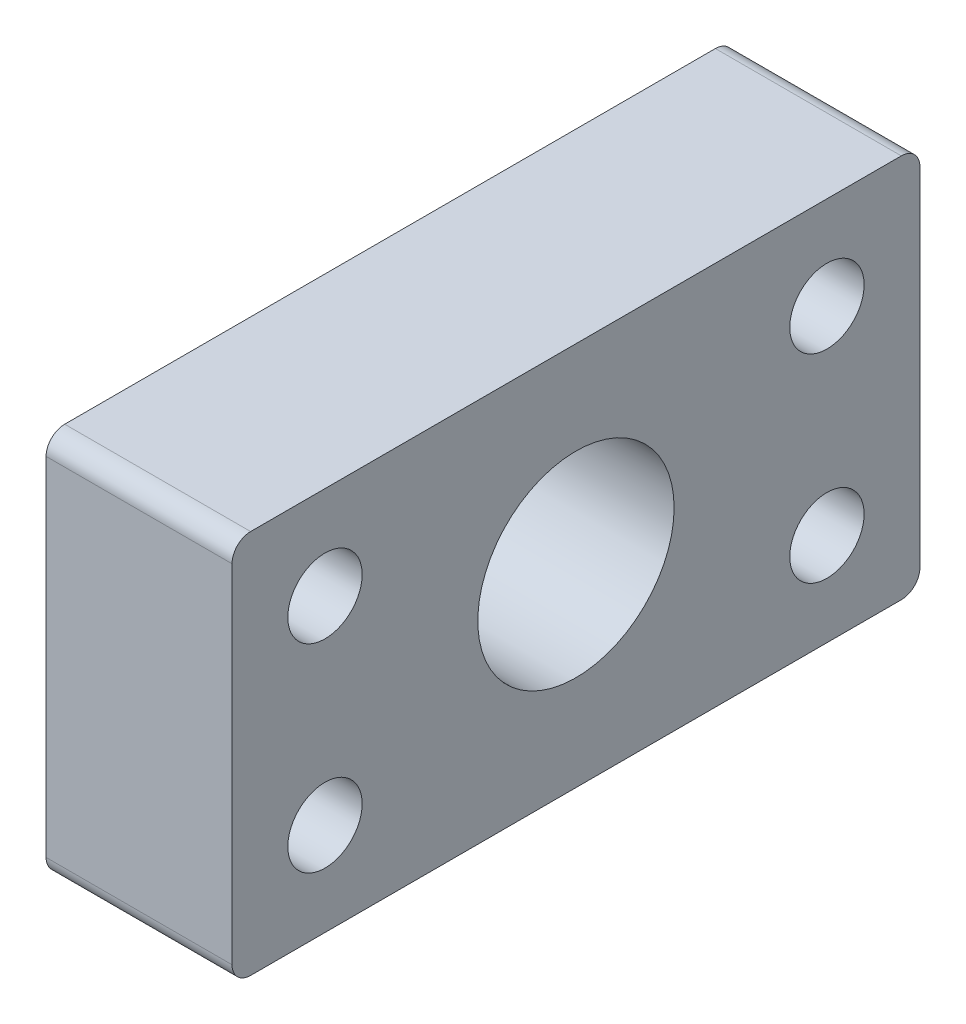
ISO-10303-21;
HEADER;
FILE_DESCRIPTION(('STEP AP214'),'2;1');
FILE_NAME('part.step','',(''),(''),'','','');
FILE_SCHEMA(('AUTOMOTIVE_DESIGN { 1 0 10303 214 1 1 1 1 }'));
ENDSEC;
DATA;
#1=APPLICATION_CONTEXT('core data for automotive mechanical design processes');
#2=APPLICATION_PROTOCOL_DEFINITION('international standard','automotive_design',2000,#1);
#3=PRODUCT_CONTEXT('',#1,'mechanical');
#4=PRODUCT('Part','Part','',(#3));
#5=PRODUCT_RELATED_PRODUCT_CATEGORY('part','',(#4));
#6=PRODUCT_DEFINITION_FORMATION('','',#4);
#7=PRODUCT_DEFINITION_CONTEXT('part definition',#1,'design');
#8=PRODUCT_DEFINITION('design','',#6,#7);
#9=PRODUCT_DEFINITION_SHAPE('','',#8);
#10=(LENGTH_UNIT() NAMED_UNIT(*) SI_UNIT(.MILLI.,.METRE.));
#11=(NAMED_UNIT(*) PLANE_ANGLE_UNIT() SI_UNIT($,.RADIAN.));
#12=(NAMED_UNIT(*) SI_UNIT($,.STERADIAN.) SOLID_ANGLE_UNIT());
#13=UNCERTAINTY_MEASURE_WITH_UNIT(LENGTH_MEASURE(1.E-05),#10,'distance_accuracy_value','');
#14=(GEOMETRIC_REPRESENTATION_CONTEXT(3) GLOBAL_UNCERTAINTY_ASSIGNED_CONTEXT((#13)) GLOBAL_UNIT_ASSIGNED_CONTEXT((#10,
#11,#12)) REPRESENTATION_CONTEXT('',''));
#15=CARTESIAN_POINT('',(0.,0.,0.));
#16=DIRECTION('',(0.,0.,1.));
#17=DIRECTION('',(1.,0.,0.));
#18=AXIS2_PLACEMENT_3D('',#15,#16,#17);
#19=CARTESIAN_POINT('',(10.,0.,-32.));
#20=DIRECTION('',(0.,0.,1.));
#21=DIRECTION('',(1.,0.,0.));
#22=AXIS2_PLACEMENT_3D('',#19,#20,#21);
#23=PLANE('',#22);
#24=DIRECTION('',(0.,1.,0.));
#25=VECTOR('',#24,1.);
#26=CARTESIAN_POINT('',(10.,0.,-32.));
#27=LINE('',#26,#25);
#28=CARTESIAN_POINT('',(10.,-4.,-32.));
#29=VERTEX_POINT('',#28);
#30=CARTESIAN_POINT('',(10.,14.68,-32.));
#31=VERTEX_POINT('',#30);
#32=EDGE_CURVE('E121',#29,#31,#27,.T.);
#33=ORIENTED_EDGE('',*,*,#32,.F.);
#34=DIRECTION('',(-1.,0.,0.));
#35=VECTOR('',#34,1.);
#36=CARTESIAN_POINT('',(0.,-4.,-32.));
#37=LINE('',#36,#35);
#38=CARTESIAN_POINT('',(0.,-4.,-32.));
#39=VERTEX_POINT('',#38);
#40=EDGE_CURVE('E106',#29,#39,#37,.T.);
#41=ORIENTED_EDGE('',*,*,#40,.T.);
#42=DIRECTION('',(0.,1.,0.));
#43=VECTOR('',#42,1.);
#44=CARTESIAN_POINT('',(0.,0.,-32.));
#45=LINE('',#44,#43);
#46=CARTESIAN_POINT('',(0.,14.68,-32.));
#47=VERTEX_POINT('',#46);
#48=EDGE_CURVE('E118',#39,#47,#45,.T.);
#49=ORIENTED_EDGE('',*,*,#48,.T.);
#50=DIRECTION('',(-1.,0.,0.));
#51=VECTOR('',#50,1.);
#52=CARTESIAN_POINT('',(10.,14.68,-32.));
#53=LINE('',#52,#51);
#54=EDGE_CURVE('E123',#47,#31,#53,.F.);
#55=ORIENTED_EDGE('',*,*,#54,.T.);
#56=EDGE_LOOP('',(#33,#41,#49,#55));
#57=FACE_BOUND('',#56,.T.);
#58=ADVANCED_FACE('F37',(#57),#23,.F.);
#59=CARTESIAN_POINT('',(10.,15.68,0.));
#60=DIRECTION('',(0.,-1.,0.));
#61=DIRECTION('',(0.,0.,-1.));
#62=AXIS2_PLACEMENT_3D('',#59,#60,#61);
#63=PLANE('',#62);
#64=DIRECTION('',(0.,0.,1.));
#65=VECTOR('',#64,1.);
#66=CARTESIAN_POINT('',(10.,15.68,0.));
#67=LINE('',#66,#65);
#68=CARTESIAN_POINT('',(10.,15.68,-31.));
#69=VERTEX_POINT('',#68);
#70=CARTESIAN_POINT('',(10.,15.68,4.));
#71=VERTEX_POINT('',#70);
#72=EDGE_CURVE('E177',#69,#71,#67,.T.);
#73=ORIENTED_EDGE('',*,*,#72,.F.);
#74=DIRECTION('',(-1.,0.,0.));
#75=VECTOR('',#74,1.);
#76=CARTESIAN_POINT('',(10.,15.68,-31.));
#77=LINE('',#76,#75);
#78=CARTESIAN_POINT('',(0.,15.68,-31.));
#79=VERTEX_POINT('',#78);
#80=EDGE_CURVE('E161',#69,#79,#77,.T.);
#81=ORIENTED_EDGE('',*,*,#80,.T.);
#82=DIRECTION('',(0.,0.,1.));
#83=VECTOR('',#82,1.);
#84=CARTESIAN_POINT('',(0.,15.68,0.));
#85=LINE('',#84,#83);
#86=CARTESIAN_POINT('',(0.,15.68,4.));
#87=VERTEX_POINT('',#86);
#88=EDGE_CURVE('E127',#79,#87,#85,.T.);
#89=ORIENTED_EDGE('',*,*,#88,.T.);
#90=DIRECTION('',(-1.,0.,0.));
#91=VECTOR('',#90,1.);
#92=CARTESIAN_POINT('',(10.,15.68,4.));
#93=LINE('',#92,#91);
#94=EDGE_CURVE('E159',#87,#71,#93,.F.);
#95=ORIENTED_EDGE('',*,*,#94,.T.);
#96=EDGE_LOOP('',(#73,#81,#89,#95));
#97=FACE_BOUND('',#96,.T.);
#98=ADVANCED_FACE('F211',(#97),#63,.F.);
#99=CARTESIAN_POINT('',(10.,0.,5.));
#100=DIRECTION('',(0.,0.,1.));
#101=DIRECTION('',(1.,0.,0.));
#102=AXIS2_PLACEMENT_3D('',#99,#100,#101);
#103=PLANE('',#102);
#104=DIRECTION('',(0.,1.,0.));
#105=VECTOR('',#104,1.);
#106=CARTESIAN_POINT('',(0.,0.,5.));
#107=LINE('',#106,#105);
#108=CARTESIAN_POINT('',(0.,-4.,5.));
#109=VERTEX_POINT('',#108);
#110=CARTESIAN_POINT('',(0.,14.68,5.));
#111=VERTEX_POINT('',#110);
#112=EDGE_CURVE('E131',#109,#111,#107,.T.);
#113=ORIENTED_EDGE('',*,*,#112,.F.);
#114=DIRECTION('',(-1.,0.,0.));
#115=VECTOR('',#114,1.);
#116=CARTESIAN_POINT('',(10.,-4.,5.));
#117=LINE('',#116,#115);
#118=CARTESIAN_POINT('',(10.,-4.,5.));
#119=VERTEX_POINT('',#118);
#120=EDGE_CURVE('E11',#109,#119,#117,.F.);
#121=ORIENTED_EDGE('',*,*,#120,.T.);
#122=DIRECTION('',(0.,1.,0.));
#123=VECTOR('',#122,1.);
#124=CARTESIAN_POINT('',(10.,0.,5.));
#125=LINE('',#124,#123);
#126=CARTESIAN_POINT('',(10.,14.68,5.));
#127=VERTEX_POINT('',#126);
#128=EDGE_CURVE('E166',#119,#127,#125,.T.);
#129=ORIENTED_EDGE('',*,*,#128,.T.);
#130=DIRECTION('',(-1.,0.,0.));
#131=VECTOR('',#130,1.);
#132=CARTESIAN_POINT('',(0.,14.68,5.));
#133=LINE('',#132,#131);
#134=EDGE_CURVE('E45',#127,#111,#133,.T.);
#135=ORIENTED_EDGE('',*,*,#134,.T.);
#136=EDGE_LOOP('',(#113,#121,#129,#135));
#137=FACE_BOUND('',#136,.T.);
#138=ADVANCED_FACE('F165',(#137),#103,.T.);
#139=CARTESIAN_POINT('',(10.,10.68,0.));
#140=DIRECTION('',(-1.,0.,0.));
#141=DIRECTION('',(0.,0.,1.));
#142=AXIS2_PLACEMENT_3D('',#139,#140,#141);
#143=CYLINDRICAL_SURFACE('',#142,2.);
#144=CARTESIAN_POINT('',(10.,10.68,0.));
#145=DIRECTION('',(1.,0.,0.));
#146=DIRECTION('',(0.,0.,-1.));
#147=AXIS2_PLACEMENT_3D('',#144,#145,#146);
#148=CIRCLE('',#147,2.);
#149=CARTESIAN_POINT('',(10.,10.68,-2.));
#150=VERTEX_POINT('',#149);
#151=EDGE_CURVE('E248',#150,#150,#148,.T.);
#152=ORIENTED_EDGE('',*,*,#151,.T.);
#153=EDGE_LOOP('',(#152));
#154=FACE_BOUND('',#153,.T.);
#155=CARTESIAN_POINT('',(0.,10.68,0.));
#156=DIRECTION('',(1.,0.,0.));
#157=DIRECTION('',(0.,0.,-1.));
#158=AXIS2_PLACEMENT_3D('',#155,#156,#157);
#159=CIRCLE('',#158,2.);
#160=CARTESIAN_POINT('',(0.,10.68,-2.));
#161=VERTEX_POINT('',#160);
#162=EDGE_CURVE('E128',#161,#161,#159,.T.);
#163=ORIENTED_EDGE('',*,*,#162,.F.);
#164=EDGE_LOOP('',(#163));
#165=FACE_BOUND('',#164,.T.);
#166=ADVANCED_FACE('F197',(#154,#165),#143,.F.);
#167=CARTESIAN_POINT('',(10.,10.68,-27.));
#168=DIRECTION('',(-1.,0.,0.));
#169=DIRECTION('',(0.,0.,1.));
#170=AXIS2_PLACEMENT_3D('',#167,#168,#169);
#171=CYLINDRICAL_SURFACE('',#170,2.);
#172=CARTESIAN_POINT('',(10.,10.68,-27.));
#173=DIRECTION('',(1.,0.,0.));
#174=DIRECTION('',(0.,0.,-1.));
#175=AXIS2_PLACEMENT_3D('',#172,#173,#174);
#176=CIRCLE('',#175,2.);
#177=CARTESIAN_POINT('',(10.,10.68,-29.));
#178=VERTEX_POINT('',#177);
#179=EDGE_CURVE('E245',#178,#178,#176,.T.);
#180=ORIENTED_EDGE('',*,*,#179,.T.);
#181=EDGE_LOOP('',(#180));
#182=FACE_BOUND('',#181,.T.);
#183=CARTESIAN_POINT('',(0.,10.68,-27.));
#184=DIRECTION('',(1.,0.,0.));
#185=DIRECTION('',(0.,0.,-1.));
#186=AXIS2_PLACEMENT_3D('',#183,#184,#185);
#187=CIRCLE('',#186,2.);
#188=CARTESIAN_POINT('',(0.,10.68,-29.));
#189=VERTEX_POINT('',#188);
#190=EDGE_CURVE('E134',#189,#189,#187,.T.);
#191=ORIENTED_EDGE('',*,*,#190,.F.);
#192=EDGE_LOOP('',(#191));
#193=FACE_BOUND('',#192,.T.);
#194=ADVANCED_FACE('F194',(#182,#193),#171,.F.);
#195=CARTESIAN_POINT('',(10.,0.,-27.));
#196=DIRECTION('',(-1.,0.,0.));
#197=DIRECTION('',(0.,0.,1.));
#198=AXIS2_PLACEMENT_3D('',#195,#196,#197);
#199=CYLINDRICAL_SURFACE('',#198,2.);
#200=CARTESIAN_POINT('',(10.,0.,-27.));
#201=DIRECTION('',(1.,0.,0.));
#202=DIRECTION('',(0.,0.,-1.));
#203=AXIS2_PLACEMENT_3D('',#200,#201,#202);
#204=CIRCLE('',#203,2.);
#205=CARTESIAN_POINT('',(10.,0.,-29.));
#206=VERTEX_POINT('',#205);
#207=EDGE_CURVE('E242',#206,#206,#204,.T.);
#208=ORIENTED_EDGE('',*,*,#207,.T.);
#209=EDGE_LOOP('',(#208));
#210=FACE_BOUND('',#209,.T.);
#211=CARTESIAN_POINT('',(0.,0.,-27.));
#212=DIRECTION('',(1.,0.,0.));
#213=DIRECTION('',(0.,0.,-1.));
#214=AXIS2_PLACEMENT_3D('',#211,#212,#213);
#215=CIRCLE('',#214,2.);
#216=CARTESIAN_POINT('',(0.,0.,-29.));
#217=VERTEX_POINT('',#216);
#218=EDGE_CURVE('E187',#217,#217,#215,.T.);
#219=ORIENTED_EDGE('',*,*,#218,.F.);
#220=EDGE_LOOP('',(#219));
#221=FACE_BOUND('',#220,.T.);
#222=ADVANCED_FACE('F196',(#210,#221),#199,.F.);
#223=CARTESIAN_POINT('',(10.,0.,0.));
#224=DIRECTION('',(-1.,0.,0.));
#225=DIRECTION('',(0.,0.,1.));
#226=AXIS2_PLACEMENT_3D('',#223,#224,#225);
#227=CYLINDRICAL_SURFACE('',#226,2.);
#228=CARTESIAN_POINT('',(10.,0.,0.));
#229=DIRECTION('',(1.,0.,0.));
#230=DIRECTION('',(0.,0.,-1.));
#231=AXIS2_PLACEMENT_3D('',#228,#229,#230);
#232=CIRCLE('',#231,2.);
#233=CARTESIAN_POINT('',(10.,0.,-2.));
#234=VERTEX_POINT('',#233);
#235=EDGE_CURVE('E238',#234,#234,#232,.T.);
#236=ORIENTED_EDGE('',*,*,#235,.T.);
#237=EDGE_LOOP('',(#236));
#238=FACE_BOUND('',#237,.T.);
#239=CARTESIAN_POINT('',(0.,0.,0.));
#240=DIRECTION('',(1.,0.,0.));
#241=DIRECTION('',(0.,0.,-1.));
#242=AXIS2_PLACEMENT_3D('',#239,#240,#241);
#243=CIRCLE('',#242,2.);
#244=CARTESIAN_POINT('',(0.,0.,-2.));
#245=VERTEX_POINT('',#244);
#246=EDGE_CURVE('E184',#245,#245,#243,.T.);
#247=ORIENTED_EDGE('',*,*,#246,.F.);
#248=EDGE_LOOP('',(#247));
#249=FACE_BOUND('',#248,.T.);
#250=ADVANCED_FACE('F204',(#238,#249),#227,.F.);
#251=CARTESIAN_POINT('',(10.,5.39966999333004,-13.5));
#252=DIRECTION('',(-1.,0.,0.));
#253=DIRECTION('',(0.,0.,1.));
#254=AXIS2_PLACEMENT_3D('',#251,#252,#253);
#255=CYLINDRICAL_SURFACE('',#254,5.28033000666996);
#256=CARTESIAN_POINT('',(10.,5.39966999333004,-13.5));
#257=DIRECTION('',(1.,0.,0.));
#258=DIRECTION('',(0.,0.,-1.));
#259=AXIS2_PLACEMENT_3D('',#256,#257,#258);
#260=CIRCLE('',#259,5.28033000666996);
#261=CARTESIAN_POINT('',(10.,5.39966999333004,-18.78033000667));
#262=VERTEX_POINT('',#261);
#263=EDGE_CURVE('E142',#262,#262,#260,.T.);
#264=ORIENTED_EDGE('',*,*,#263,.T.);
#265=EDGE_LOOP('',(#264));
#266=FACE_BOUND('',#265,.T.);
#267=CARTESIAN_POINT('',(0.,5.39966999333004,-13.5));
#268=DIRECTION('',(1.,0.,0.));
#269=DIRECTION('',(0.,0.,-1.));
#270=AXIS2_PLACEMENT_3D('',#267,#268,#269);
#271=CIRCLE('',#270,5.28033000666996);
#272=CARTESIAN_POINT('',(0.,5.39966999333004,-18.78033000667));
#273=VERTEX_POINT('',#272);
#274=EDGE_CURVE('E181',#273,#273,#271,.T.);
#275=ORIENTED_EDGE('',*,*,#274,.F.);
#276=EDGE_LOOP('',(#275));
#277=FACE_BOUND('',#276,.T.);
#278=ADVANCED_FACE('F224',(#266,#277),#255,.F.);
#279=CARTESIAN_POINT('',(10.,-5.,0.));
#280=DIRECTION('',(0.,-1.,0.));
#281=DIRECTION('',(0.,0.,-1.));
#282=AXIS2_PLACEMENT_3D('',#279,#280,#281);
#283=PLANE('',#282);
#284=DIRECTION('',(0.,0.,1.));
#285=VECTOR('',#284,1.);
#286=CARTESIAN_POINT('',(0.,-5.,0.));
#287=LINE('',#286,#285);
#288=CARTESIAN_POINT('',(0.,-5.,-31.));
#289=VERTEX_POINT('',#288);
#290=CARTESIAN_POINT('',(0.,-5.,4.));
#291=VERTEX_POINT('',#290);
#292=EDGE_CURVE('E140',#289,#291,#287,.T.);
#293=ORIENTED_EDGE('',*,*,#292,.F.);
#294=DIRECTION('',(-1.,0.,0.));
#295=VECTOR('',#294,1.);
#296=CARTESIAN_POINT('',(10.,-5.,-31.));
#297=LINE('',#296,#295);
#298=CARTESIAN_POINT('',(10.,-5.,-31.));
#299=VERTEX_POINT('',#298);
#300=EDGE_CURVE('E107',#289,#299,#297,.F.);
#301=ORIENTED_EDGE('',*,*,#300,.T.);
#302=DIRECTION('',(0.,0.,1.));
#303=VECTOR('',#302,1.);
#304=CARTESIAN_POINT('',(10.,-5.,0.));
#305=LINE('',#304,#303);
#306=CARTESIAN_POINT('',(10.,-5.,4.));
#307=VERTEX_POINT('',#306);
#308=EDGE_CURVE('E143',#299,#307,#305,.T.);
#309=ORIENTED_EDGE('',*,*,#308,.T.);
#310=DIRECTION('',(-1.,0.,0.));
#311=VECTOR('',#310,1.);
#312=CARTESIAN_POINT('',(10.,-5.,4.));
#313=LINE('',#312,#311);
#314=EDGE_CURVE('E112',#307,#291,#313,.T.);
#315=ORIENTED_EDGE('',*,*,#314,.T.);
#316=EDGE_LOOP('',(#293,#301,#309,#315));
#317=FACE_BOUND('',#316,.T.);
#318=ADVANCED_FACE('F174',(#317),#283,.T.);
#319=CARTESIAN_POINT('',(10.,0.,0.));
#320=DIRECTION('',(1.,0.,0.));
#321=DIRECTION('',(0.,0.,-1.));
#322=AXIS2_PLACEMENT_3D('',#319,#320,#321);
#323=PLANE('',#322);
#324=ORIENTED_EDGE('',*,*,#263,.F.);
#325=EDGE_LOOP('',(#324));
#326=FACE_BOUND('',#325,.T.);
#327=ORIENTED_EDGE('',*,*,#235,.F.);
#328=EDGE_LOOP('',(#327));
#329=FACE_BOUND('',#328,.T.);
#330=ORIENTED_EDGE('',*,*,#207,.F.);
#331=EDGE_LOOP('',(#330));
#332=FACE_BOUND('',#331,.T.);
#333=ORIENTED_EDGE('',*,*,#179,.F.);
#334=EDGE_LOOP('',(#333));
#335=FACE_BOUND('',#334,.T.);
#336=ORIENTED_EDGE('',*,*,#151,.F.);
#337=EDGE_LOOP('',(#336));
#338=FACE_BOUND('',#337,.T.);
#339=ORIENTED_EDGE('',*,*,#308,.F.);
#340=CARTESIAN_POINT('',(10.,-4.,-31.));
#341=DIRECTION('',(1.,0.,0.));
#342=DIRECTION('',(0.,0.,-1.));
#343=AXIS2_PLACEMENT_3D('',#340,#341,#342);
#344=CIRCLE('',#343,1.);
#345=EDGE_CURVE('E157',#299,#29,#344,.T.);
#346=ORIENTED_EDGE('',*,*,#345,.T.);
#347=ORIENTED_EDGE('',*,*,#32,.T.);
#348=CARTESIAN_POINT('',(10.,14.68,-31.));
#349=DIRECTION('',(1.,0.,0.));
#350=DIRECTION('',(0.,0.,-1.));
#351=AXIS2_PLACEMENT_3D('',#348,#349,#350);
#352=CIRCLE('',#351,1.);
#353=EDGE_CURVE('E155',#31,#69,#352,.T.);
#354=ORIENTED_EDGE('',*,*,#353,.T.);
#355=ORIENTED_EDGE('',*,*,#72,.T.);
#356=CARTESIAN_POINT('',(10.,14.68,4.));
#357=DIRECTION('',(1.,0.,0.));
#358=DIRECTION('',(0.,0.,-1.));
#359=AXIS2_PLACEMENT_3D('',#356,#357,#358);
#360=CIRCLE('',#359,1.);
#361=EDGE_CURVE('E52',#71,#127,#360,.T.);
#362=ORIENTED_EDGE('',*,*,#361,.T.);
#363=ORIENTED_EDGE('',*,*,#128,.F.);
#364=CARTESIAN_POINT('',(10.,-4.,4.));
#365=DIRECTION('',(1.,0.,0.));
#366=DIRECTION('',(0.,0.,-1.));
#367=AXIS2_PLACEMENT_3D('',#364,#365,#366);
#368=CIRCLE('',#367,1.);
#369=EDGE_CURVE('E153',#119,#307,#368,.T.);
#370=ORIENTED_EDGE('',*,*,#369,.T.);
#371=EDGE_LOOP('',(#339,#346,#347,#354,#355,#362,#363,#370));
#372=FACE_BOUND('',#371,.T.);
#373=ADVANCED_FACE('F223',(#326,#329,#332,#335,#338,#372),#323,.T.);
#374=CARTESIAN_POINT('',(0.,0.,0.));
#375=DIRECTION('',(1.,0.,0.));
#376=DIRECTION('',(0.,0.,-1.));
#377=AXIS2_PLACEMENT_3D('',#374,#375,#376);
#378=PLANE('',#377);
#379=ORIENTED_EDGE('',*,*,#274,.T.);
#380=EDGE_LOOP('',(#379));
#381=FACE_BOUND('',#380,.T.);
#382=ORIENTED_EDGE('',*,*,#246,.T.);
#383=EDGE_LOOP('',(#382));
#384=FACE_BOUND('',#383,.T.);
#385=ORIENTED_EDGE('',*,*,#218,.T.);
#386=EDGE_LOOP('',(#385));
#387=FACE_BOUND('',#386,.T.);
#388=ORIENTED_EDGE('',*,*,#190,.T.);
#389=EDGE_LOOP('',(#388));
#390=FACE_BOUND('',#389,.T.);
#391=ORIENTED_EDGE('',*,*,#162,.T.);
#392=EDGE_LOOP('',(#391));
#393=FACE_BOUND('',#392,.T.);
#394=ORIENTED_EDGE('',*,*,#48,.F.);
#395=CARTESIAN_POINT('',(0.,-4.,-31.));
#396=DIRECTION('',(1.,0.,0.));
#397=DIRECTION('',(0.,0.,-1.));
#398=AXIS2_PLACEMENT_3D('',#395,#396,#397);
#399=CIRCLE('',#398,1.);
#400=EDGE_CURVE('E102',#39,#289,#399,.F.);
#401=ORIENTED_EDGE('',*,*,#400,.T.);
#402=ORIENTED_EDGE('',*,*,#292,.T.);
#403=CARTESIAN_POINT('',(0.,-4.,4.));
#404=DIRECTION('',(1.,0.,0.));
#405=DIRECTION('',(0.,0.,-1.));
#406=AXIS2_PLACEMENT_3D('',#403,#404,#405);
#407=CIRCLE('',#406,1.);
#408=EDGE_CURVE('E146',#291,#109,#407,.F.);
#409=ORIENTED_EDGE('',*,*,#408,.T.);
#410=ORIENTED_EDGE('',*,*,#112,.T.);
#411=CARTESIAN_POINT('',(0.,14.68,4.));
#412=DIRECTION('',(1.,0.,0.));
#413=DIRECTION('',(0.,0.,-1.));
#414=AXIS2_PLACEMENT_3D('',#411,#412,#413);
#415=CIRCLE('',#414,1.);
#416=EDGE_CURVE('E122',#111,#87,#415,.F.);
#417=ORIENTED_EDGE('',*,*,#416,.T.);
#418=ORIENTED_EDGE('',*,*,#88,.F.);
#419=CARTESIAN_POINT('',(0.,14.68,-31.));
#420=DIRECTION('',(1.,0.,0.));
#421=DIRECTION('',(0.,0.,-1.));
#422=AXIS2_PLACEMENT_3D('',#419,#420,#421);
#423=CIRCLE('',#422,1.);
#424=EDGE_CURVE('E113',#79,#47,#423,.F.);
#425=ORIENTED_EDGE('',*,*,#424,.T.);
#426=EDGE_LOOP('',(#394,#401,#402,#409,#410,#417,#418,#425));
#427=FACE_BOUND('',#426,.T.);
#428=ADVANCED_FACE('F125',(#381,#384,#387,#390,#393,#427),#378,.F.);
#429=CARTESIAN_POINT('',(10.,-4.,-31.));
#430=DIRECTION('',(1.,0.,0.));
#431=DIRECTION('',(0.,0.,-1.));
#432=AXIS2_PLACEMENT_3D('',#429,#430,#431);
#433=CYLINDRICAL_SURFACE('',#432,1.);
#434=ORIENTED_EDGE('',*,*,#345,.F.);
#435=ORIENTED_EDGE('',*,*,#300,.F.);
#436=ORIENTED_EDGE('',*,*,#400,.F.);
#437=ORIENTED_EDGE('',*,*,#40,.F.);
#438=EDGE_LOOP('',(#434,#435,#436,#437));
#439=FACE_BOUND('',#438,.T.);
#440=ADVANCED_FACE('F105',(#439),#433,.T.);
#441=CARTESIAN_POINT('',(10.,14.68,-31.));
#442=DIRECTION('',(-1.,0.,0.));
#443=DIRECTION('',(0.,0.,1.));
#444=AXIS2_PLACEMENT_3D('',#441,#442,#443);
#445=CYLINDRICAL_SURFACE('',#444,1.);
#446=ORIENTED_EDGE('',*,*,#353,.F.);
#447=ORIENTED_EDGE('',*,*,#54,.F.);
#448=ORIENTED_EDGE('',*,*,#424,.F.);
#449=ORIENTED_EDGE('',*,*,#80,.F.);
#450=EDGE_LOOP('',(#446,#447,#448,#449));
#451=FACE_BOUND('',#450,.T.);
#452=ADVANCED_FACE('F258',(#451),#445,.T.);
#453=CARTESIAN_POINT('',(10.,-4.,4.));
#454=DIRECTION('',(-1.,0.,0.));
#455=DIRECTION('',(0.,0.,1.));
#456=AXIS2_PLACEMENT_3D('',#453,#454,#455);
#457=CYLINDRICAL_SURFACE('',#456,1.);
#458=ORIENTED_EDGE('',*,*,#369,.F.);
#459=ORIENTED_EDGE('',*,*,#120,.F.);
#460=ORIENTED_EDGE('',*,*,#408,.F.);
#461=ORIENTED_EDGE('',*,*,#314,.F.);
#462=EDGE_LOOP('',(#458,#459,#460,#461));
#463=FACE_BOUND('',#462,.T.);
#464=ADVANCED_FACE('F171',(#463),#457,.T.);
#465=CARTESIAN_POINT('',(10.,14.68,4.));
#466=DIRECTION('',(1.,0.,0.));
#467=DIRECTION('',(0.,0.,-1.));
#468=AXIS2_PLACEMENT_3D('',#465,#466,#467);
#469=CYLINDRICAL_SURFACE('',#468,1.);
#470=ORIENTED_EDGE('',*,*,#361,.F.);
#471=ORIENTED_EDGE('',*,*,#94,.F.);
#472=ORIENTED_EDGE('',*,*,#416,.F.);
#473=ORIENTED_EDGE('',*,*,#134,.F.);
#474=EDGE_LOOP('',(#470,#471,#472,#473));
#475=FACE_BOUND('',#474,.T.);
#476=ADVANCED_FACE('F39',(#475),#469,.T.);
#477=CLOSED_SHELL('',(#58,#98,#138,#166,#194,#222,#250,#278,#318,#373,#428,#440,#452,#464,#476));
#478=MANIFOLD_SOLID_BREP('B2',#477);
#479=ADVANCED_BREP_SHAPE_REPRESENTATION('',(#18,#478),#14);
#480=SHAPE_DEFINITION_REPRESENTATION(#9,#479);
ENDSEC;
END-ISO-10303-21;
